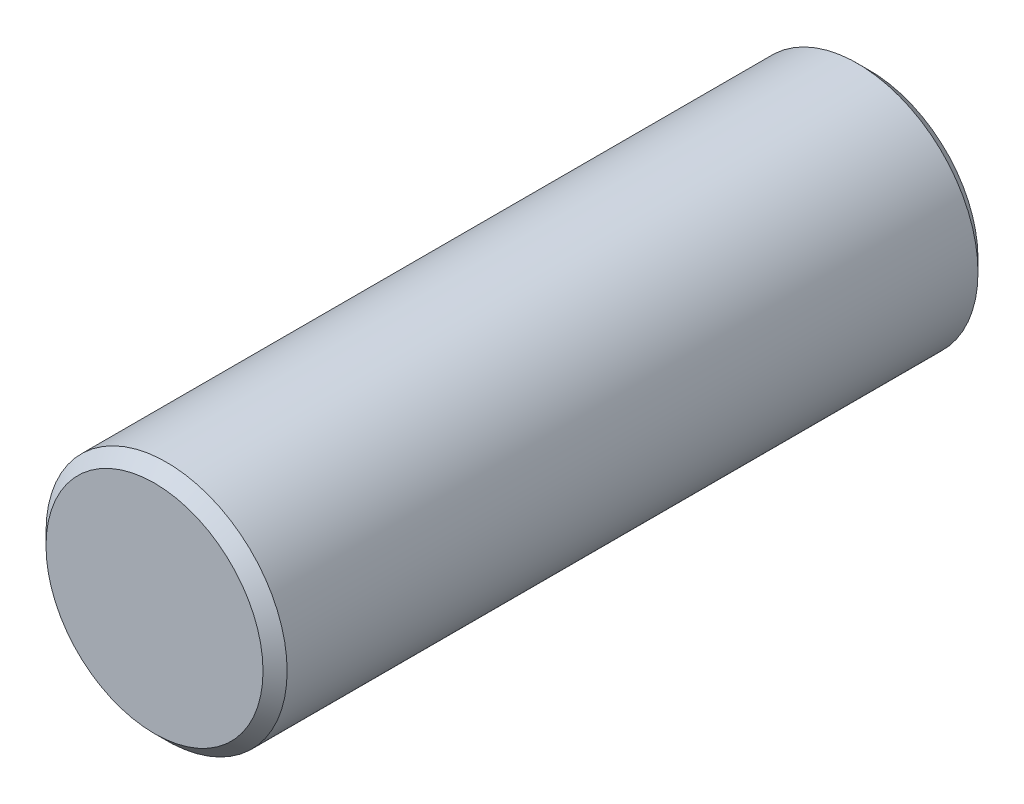
ISO-10303-21;
HEADER;
FILE_DESCRIPTION(('STEP AP214'),'2;1');
FILE_NAME('part.step','',(''),(''),'','','');
FILE_SCHEMA(('AUTOMOTIVE_DESIGN { 1 0 10303 214 1 1 1 1 }'));
ENDSEC;
DATA;
#1=APPLICATION_CONTEXT('core data for automotive mechanical design processes');
#2=APPLICATION_PROTOCOL_DEFINITION('international standard','automotive_design',2000,#1);
#3=PRODUCT_CONTEXT('',#1,'mechanical');
#4=PRODUCT('Part','Part','',(#3));
#5=PRODUCT_RELATED_PRODUCT_CATEGORY('part','',(#4));
#6=PRODUCT_DEFINITION_FORMATION('','',#4);
#7=PRODUCT_DEFINITION_CONTEXT('part definition',#1,'design');
#8=PRODUCT_DEFINITION('design','',#6,#7);
#9=PRODUCT_DEFINITION_SHAPE('','',#8);
#10=(LENGTH_UNIT() NAMED_UNIT(*) SI_UNIT(.MILLI.,.METRE.));
#11=(NAMED_UNIT(*) PLANE_ANGLE_UNIT() SI_UNIT($,.RADIAN.));
#12=(NAMED_UNIT(*) SI_UNIT($,.STERADIAN.) SOLID_ANGLE_UNIT());
#13=UNCERTAINTY_MEASURE_WITH_UNIT(LENGTH_MEASURE(1.E-05),#10,'distance_accuracy_value','');
#14=(GEOMETRIC_REPRESENTATION_CONTEXT(3) GLOBAL_UNCERTAINTY_ASSIGNED_CONTEXT((#13)) GLOBAL_UNIT_ASSIGNED_CONTEXT((#10,
#11,#12)) REPRESENTATION_CONTEXT('',''));
#15=CARTESIAN_POINT('',(0.,0.,0.));
#16=DIRECTION('',(0.,0.,1.));
#17=DIRECTION('',(1.,0.,0.));
#18=AXIS2_PLACEMENT_3D('',#15,#16,#17);
#19=CARTESIAN_POINT('',(0.,0.,29.65));
#20=DIRECTION('',(0.,0.,-1.));
#21=DIRECTION('',(-1.,0.,0.));
#22=AXIS2_PLACEMENT_3D('',#19,#20,#21);
#23=CYLINDRICAL_SURFACE('',#22,5.);
#24=CARTESIAN_POINT('',(0.,0.,0.500000000000035));
#25=DIRECTION('',(0.,0.,1.));
#26=DIRECTION('',(1.,0.,0.));
#27=AXIS2_PLACEMENT_3D('',#24,#25,#26);
#28=CIRCLE('',#27,5.);
#29=CARTESIAN_POINT('',(-5.,0.,0.500000000000035));
#30=VERTEX_POINT('',#29);
#31=EDGE_CURVE('E45',#30,#30,#28,.T.);
#32=CARTESIAN_POINT('',(0.,0.,29.15));
#33=DIRECTION('',(0.,0.,1.));
#34=DIRECTION('',(1.,0.,0.));
#35=AXIS2_PLACEMENT_3D('',#32,#33,#34);
#36=CIRCLE('',#35,5.);
#37=CARTESIAN_POINT('',(-5.,0.,29.15));
#38=VERTEX_POINT('',#37);
#39=EDGE_CURVE('E49',#38,#38,#36,.F.);
#40=CARTESIAN_POINT('',(-5.,0.,0.500000000000035));
#41=CARTESIAN_POINT('',(-5.,0.,0.798437500000035));
#42=CARTESIAN_POINT('',(-5.,0.,1.09687500000003));
#43=CARTESIAN_POINT('',(-5.,0.,1.69375000000003));
#44=CARTESIAN_POINT('',(-5.,0.,1.99218750000003));
#45=CARTESIAN_POINT('',(-5.,0.,2.58906250000003));
#46=CARTESIAN_POINT('',(-5.,0.,2.88750000000003));
#47=CARTESIAN_POINT('',(-5.,0.,3.48437500000003));
#48=CARTESIAN_POINT('',(-5.,0.,3.78281250000003));
#49=CARTESIAN_POINT('',(-5.,0.,4.37968750000003));
#50=CARTESIAN_POINT('',(-5.,0.,4.67812500000003));
#51=CARTESIAN_POINT('',(-5.,0.,5.27500000000003));
#52=CARTESIAN_POINT('',(-5.,0.,5.57343750000003));
#53=CARTESIAN_POINT('',(-5.,0.,6.17031250000003));
#54=CARTESIAN_POINT('',(-5.,0.,6.46875000000003));
#55=CARTESIAN_POINT('',(-5.,0.,7.06562500000003));
#56=CARTESIAN_POINT('',(-5.,0.,7.36406250000003));
#57=CARTESIAN_POINT('',(-5.,0.,7.96093750000003));
#58=CARTESIAN_POINT('',(-5.,0.,8.25937500000003));
#59=CARTESIAN_POINT('',(-5.,0.,8.85625000000003));
#60=CARTESIAN_POINT('',(-5.,0.,9.15468750000003));
#61=CARTESIAN_POINT('',(-5.,0.,9.75156250000003));
#62=CARTESIAN_POINT('',(-5.,0.,10.05));
#63=CARTESIAN_POINT('',(-5.,0.,10.646875));
#64=CARTESIAN_POINT('',(-5.,0.,10.9453125));
#65=CARTESIAN_POINT('',(-5.,0.,11.5421875));
#66=CARTESIAN_POINT('',(-5.,0.,11.840625));
#67=CARTESIAN_POINT('',(-5.,0.,12.4375));
#68=CARTESIAN_POINT('',(-5.,0.,12.7359375));
#69=CARTESIAN_POINT('',(-5.,0.,13.3328125));
#70=CARTESIAN_POINT('',(-5.,0.,13.63125));
#71=CARTESIAN_POINT('',(-5.,0.,14.228125));
#72=CARTESIAN_POINT('',(-5.,0.,14.5265625));
#73=CARTESIAN_POINT('',(-5.,0.,15.1234375));
#74=CARTESIAN_POINT('',(-5.,0.,15.421875));
#75=CARTESIAN_POINT('',(-5.,0.,16.01875));
#76=CARTESIAN_POINT('',(-5.,0.,16.3171875));
#77=CARTESIAN_POINT('',(-5.,0.,16.9140625));
#78=CARTESIAN_POINT('',(-5.,0.,17.2125));
#79=CARTESIAN_POINT('',(-5.,0.,17.809375));
#80=CARTESIAN_POINT('',(-5.,0.,18.1078125));
#81=CARTESIAN_POINT('',(-5.,0.,18.7046875));
#82=CARTESIAN_POINT('',(-5.,0.,19.003125));
#83=CARTESIAN_POINT('',(-5.,0.,19.6));
#84=CARTESIAN_POINT('',(-5.,0.,19.8984375));
#85=CARTESIAN_POINT('',(-5.,0.,20.4953125));
#86=CARTESIAN_POINT('',(-5.,0.,20.79375));
#87=CARTESIAN_POINT('',(-5.,0.,21.390625));
#88=CARTESIAN_POINT('',(-5.,0.,21.6890625));
#89=CARTESIAN_POINT('',(-5.,0.,22.2859375));
#90=CARTESIAN_POINT('',(-5.,0.,22.584375));
#91=CARTESIAN_POINT('',(-5.,0.,23.18125));
#92=CARTESIAN_POINT('',(-5.,0.,23.4796875));
#93=CARTESIAN_POINT('',(-5.,0.,24.0765625));
#94=CARTESIAN_POINT('',(-5.,0.,24.375));
#95=CARTESIAN_POINT('',(-5.,0.,24.971875));
#96=CARTESIAN_POINT('',(-5.,0.,25.2703125));
#97=CARTESIAN_POINT('',(-5.,0.,25.8671875));
#98=CARTESIAN_POINT('',(-5.,0.,26.165625));
#99=CARTESIAN_POINT('',(-5.,0.,26.7625));
#100=CARTESIAN_POINT('',(-5.,0.,27.0609375));
#101=CARTESIAN_POINT('',(-5.,0.,27.6578125));
#102=CARTESIAN_POINT('',(-5.,0.,27.95625));
#103=CARTESIAN_POINT('',(-5.,0.,28.553125));
#104=CARTESIAN_POINT('',(-5.,0.,28.8515625));
#105=CARTESIAN_POINT('',(-5.,0.,29.15));
#106=B_SPLINE_CURVE_WITH_KNOTS('',3,(#40,#41,#42,#43,#44,#45,#46,#47,#48,#49,#50,#51,#52,#53,
#54,#55,#56,#57,#58,#59,#60,#61,#62,#63,#64,#65,#66,#67,#68,#69,#70,#71,#72,#73,#74,#75,#76,#77,
#78,#79,#80,#81,#82,#83,#84,#85,#86,#87,#88,#89,#90,#91,#92,#93,#94,#95,#96,#97,#98,#99,#100,
#101,#102,#103,#104,#105),.UNSPECIFIED.,.F.,.F.,(4,2,2,2,2,2,2,2,2,2,2,2,2,2,2,2,2,2,2,2,2,2,2,
2,2,2,2,2,2,2,2,2,4),(0.,0.895312499999999,1.790625,2.6859375,3.58125,4.4765625,
5.37187499999999,6.26718749999999,7.1625,8.05781249999999,8.95312499999999,9.84843749999999,
10.74375,11.6390625,12.534375,13.4296875,14.325,15.2203125,16.115625,17.0109375,17.90625,
18.8015625,19.696875,20.5921875,21.4875,22.3828125,23.278125,24.1734375,25.06875,25.9640625,
26.859375,27.7546875,28.65),.UNSPECIFIED.);
#107=EDGE_CURVE('BSEAM33',#30,#38,#106,.T.);
#108=ORIENTED_EDGE('',*,*,#31,.T.);
#109=ORIENTED_EDGE('',*,*,#39,.T.);
#110=ORIENTED_EDGE('',*,*,#107,.T.);
#111=ORIENTED_EDGE('',*,*,#107,.F.);
#112=EDGE_LOOP('',(#108,#110,#109,#111));
#113=FACE_BOUND('',#112,.T.);
#114=ADVANCED_FACE('F33',(#113),#23,.T.);
#115=CARTESIAN_POINT('',(0.,0.,29.65));
#116=DIRECTION('',(0.,0.,1.));
#117=DIRECTION('',(1.,0.,0.));
#118=AXIS2_PLACEMENT_3D('',#115,#116,#117);
#119=PLANE('',#118);
#120=CARTESIAN_POINT('',(0.,0.,29.65));
#121=DIRECTION('',(0.,0.,1.));
#122=DIRECTION('',(1.,0.,0.));
#123=AXIS2_PLACEMENT_3D('',#120,#121,#122);
#124=CIRCLE('',#123,4.50000000000001);
#125=CARTESIAN_POINT('',(4.50000000000001,0.,29.65));
#126=VERTEX_POINT('',#125);
#127=EDGE_CURVE('E10',#126,#126,#124,.T.);
#128=ORIENTED_EDGE('',*,*,#127,.T.);
#129=EDGE_LOOP('',(#128));
#130=FACE_BOUND('',#129,.T.);
#131=ADVANCED_FACE('F65',(#130),#119,.T.);
#132=CARTESIAN_POINT('',(0.,0.,0.));
#133=DIRECTION('',(0.,0.,1.));
#134=DIRECTION('',(1.,0.,0.));
#135=AXIS2_PLACEMENT_3D('',#132,#133,#134);
#136=PLANE('',#135);
#137=CARTESIAN_POINT('',(0.,0.,0.));
#138=DIRECTION('',(0.,0.,1.));
#139=DIRECTION('',(1.,0.,0.));
#140=AXIS2_PLACEMENT_3D('',#137,#138,#139);
#141=CIRCLE('',#140,4.49999999999997);
#142=CARTESIAN_POINT('',(4.49999999999997,0.,0.));
#143=VERTEX_POINT('',#142);
#144=EDGE_CURVE('E41',#143,#143,#141,.F.);
#145=ORIENTED_EDGE('',*,*,#144,.T.);
#146=EDGE_LOOP('',(#145));
#147=FACE_BOUND('',#146,.T.);
#148=ADVANCED_FACE('F62',(#147),#136,.F.);
#149=CARTESIAN_POINT('',(0.,0.,0.500000000000035));
#150=DIRECTION('',(0.,0.,1.));
#151=DIRECTION('',(1.,0.,0.));
#152=AXIS2_PLACEMENT_3D('',#149,#150,#151);
#153=CONICAL_SURFACE('',#152,5.,0.785398163397447);
#154=ORIENTED_EDGE('',*,*,#144,.F.);
#155=EDGE_LOOP('',(#154));
#156=FACE_BOUND('',#155,.T.);
#157=ORIENTED_EDGE('',*,*,#31,.F.);
#158=EDGE_LOOP('',(#157));
#159=FACE_BOUND('',#158,.T.);
#160=ADVANCED_FACE('F58',(#156,#159),#153,.T.);
#161=CARTESIAN_POINT('',(0.,0.,29.65));
#162=DIRECTION('',(0.,0.,-1.));
#163=DIRECTION('',(-1.,0.,0.));
#164=AXIS2_PLACEMENT_3D('',#161,#162,#163);
#165=CONICAL_SURFACE('',#164,4.50000000000001,0.785398163397447);
#166=ORIENTED_EDGE('',*,*,#39,.F.);
#167=EDGE_LOOP('',(#166));
#168=FACE_BOUND('',#167,.T.);
#169=ORIENTED_EDGE('',*,*,#127,.F.);
#170=EDGE_LOOP('',(#169));
#171=FACE_BOUND('',#170,.T.);
#172=ADVANCED_FACE('F36',(#168,#171),#165,.T.);
#173=CLOSED_SHELL('',(#114,#131,#148,#160,#172));
#174=MANIFOLD_SOLID_BREP('B2',#173);
#175=ADVANCED_BREP_SHAPE_REPRESENTATION('',(#18,#174),#14);
#176=SHAPE_DEFINITION_REPRESENTATION(#9,#175);
ENDSEC;
END-ISO-10303-21;
